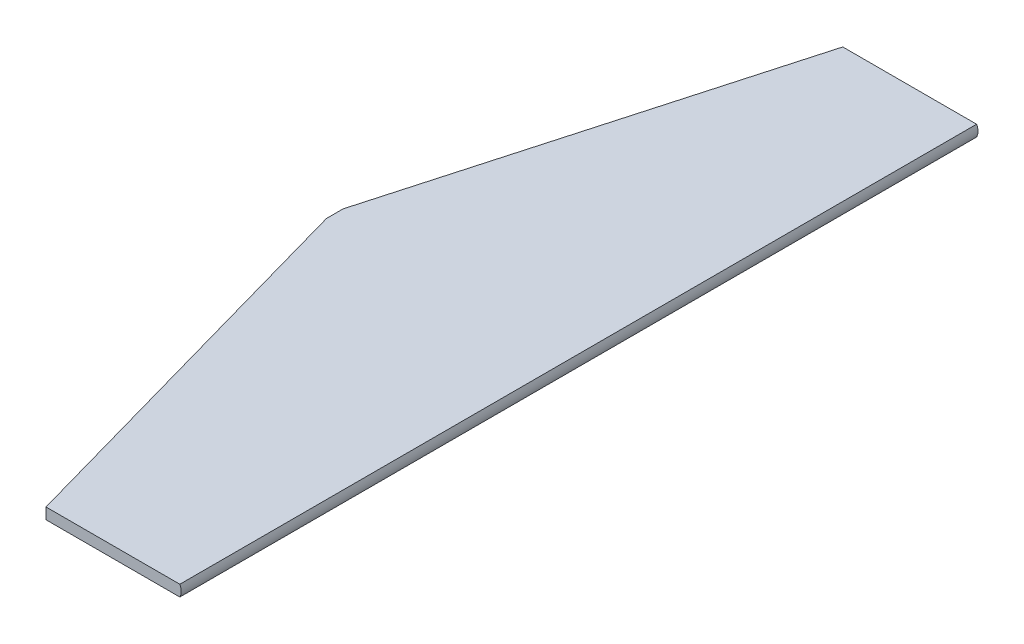
ISO-10303-21;
HEADER;
FILE_DESCRIPTION(('STEP AP214'),'2;1');
FILE_NAME('part.step','',(''),(''),'','','');
FILE_SCHEMA(('AUTOMOTIVE_DESIGN { 1 0 10303 214 1 1 1 1 }'));
ENDSEC;
DATA;
#1=APPLICATION_CONTEXT('core data for automotive mechanical design processes');
#2=APPLICATION_PROTOCOL_DEFINITION('international standard','automotive_design',2000,#1);
#3=PRODUCT_CONTEXT('',#1,'mechanical');
#4=PRODUCT('Part','Part','',(#3));
#5=PRODUCT_RELATED_PRODUCT_CATEGORY('part','',(#4));
#6=PRODUCT_DEFINITION_FORMATION('','',#4);
#7=PRODUCT_DEFINITION_CONTEXT('part definition',#1,'design');
#8=PRODUCT_DEFINITION('design','',#6,#7);
#9=PRODUCT_DEFINITION_SHAPE('','',#8);
#10=(LENGTH_UNIT() NAMED_UNIT(*) SI_UNIT(.MILLI.,.METRE.));
#11=(NAMED_UNIT(*) PLANE_ANGLE_UNIT() SI_UNIT($,.RADIAN.));
#12=(NAMED_UNIT(*) SI_UNIT($,.STERADIAN.) SOLID_ANGLE_UNIT());
#13=UNCERTAINTY_MEASURE_WITH_UNIT(LENGTH_MEASURE(1.E-05),#10,'distance_accuracy_value','');
#14=(GEOMETRIC_REPRESENTATION_CONTEXT(3) GLOBAL_UNCERTAINTY_ASSIGNED_CONTEXT((#13)) GLOBAL_UNIT_ASSIGNED_CONTEXT((#10,
#11,#12)) REPRESENTATION_CONTEXT('',''));
#15=CARTESIAN_POINT('',(0.,0.,0.));
#16=DIRECTION('',(0.,0.,1.));
#17=DIRECTION('',(1.,0.,0.));
#18=AXIS2_PLACEMENT_3D('',#15,#16,#17);
#19=CARTESIAN_POINT('',(52.4661441714905,8.,3.00000000000001));
#20=DIRECTION('',(1.,0.,0.));
#21=DIRECTION('',(0.,0.,-1.));
#22=AXIS2_PLACEMENT_3D('',#19,#20,#21);
#23=PLANE('',#22);
#24=DIRECTION('',(0.,0.,1.));
#25=VECTOR('',#24,1.);
#26=CARTESIAN_POINT('',(52.4661441714905,2.,3.00000000000001));
#27=LINE('',#26,#25);
#28=CARTESIAN_POINT('',(52.4661441714905,2.,3.00000000000001));
#29=VERTEX_POINT('',#28);
#30=CARTESIAN_POINT('',(52.4661441714905,2.,12.));
#31=VERTEX_POINT('',#30);
#32=EDGE_CURVE('E114',#29,#31,#27,.T.);
#33=ORIENTED_EDGE('',*,*,#32,.T.);
#34=DIRECTION('',(0.,-1.,0.));
#35=VECTOR('',#34,1.);
#36=CARTESIAN_POINT('',(52.4661441714905,8.,12.));
#37=LINE('',#36,#35);
#38=CARTESIAN_POINT('',(52.4661441714905,8.,12.));
#39=VERTEX_POINT('',#38);
#40=EDGE_CURVE('E11',#39,#31,#37,.T.);
#41=ORIENTED_EDGE('',*,*,#40,.F.);
#42=DIRECTION('',(0.,0.,1.));
#43=VECTOR('',#42,1.);
#44=CARTESIAN_POINT('',(52.4661441714905,8.,3.00000000000001));
#45=LINE('',#44,#43);
#46=CARTESIAN_POINT('',(52.4661441714905,8.,3.00000000000001));
#47=VERTEX_POINT('',#46);
#48=EDGE_CURVE('E122',#47,#39,#45,.T.);
#49=ORIENTED_EDGE('',*,*,#48,.F.);
#50=DIRECTION('',(0.,-1.,0.));
#51=VECTOR('',#50,1.);
#52=CARTESIAN_POINT('',(52.4661441714905,8.,3.00000000000001));
#53=LINE('',#52,#51);
#54=EDGE_CURVE('E126',#47,#29,#53,.T.);
#55=ORIENTED_EDGE('',*,*,#54,.T.);
#56=EDGE_LOOP('',(#33,#41,#49,#55));
#57=FACE_BOUND('',#56,.T.);
#58=ADVANCED_FACE('F37',(#57),#23,.F.);
#59=CARTESIAN_POINT('',(111.626144171491,8.,222.54));
#60=DIRECTION('',(0.962715715253088,0.,-0.270515159657892));
#61=DIRECTION('',(-0.270515159657892,0.,-0.962715715253088));
#62=AXIS2_PLACEMENT_3D('',#59,#60,#61);
#63=PLANE('',#62);
#64=DIRECTION('',(0.270515159657892,0.,0.962715715253088));
#65=VECTOR('',#64,1.);
#66=CARTESIAN_POINT('',(111.626144171491,2.,222.54));
#67=LINE('',#66,#65);
#68=CARTESIAN_POINT('',(111.626144171491,2.,222.54));
#69=VERTEX_POINT('',#68);
#70=EDGE_CURVE('E118',#31,#69,#67,.T.);
#71=ORIENTED_EDGE('',*,*,#70,.T.);
#72=DIRECTION('',(0.,-1.,0.));
#73=VECTOR('',#72,1.);
#74=CARTESIAN_POINT('',(111.626144171491,8.,222.54));
#75=LINE('',#74,#73);
#76=CARTESIAN_POINT('',(111.626144171491,8.,222.54));
#77=VERTEX_POINT('',#76);
#78=EDGE_CURVE('E45',#77,#69,#75,.T.);
#79=ORIENTED_EDGE('',*,*,#78,.F.);
#80=DIRECTION('',(0.270515159657892,0.,0.962715715253088));
#81=VECTOR('',#80,1.);
#82=CARTESIAN_POINT('',(111.626144171491,8.,222.54));
#83=LINE('',#82,#81);
#84=EDGE_CURVE('E88',#39,#77,#83,.T.);
#85=ORIENTED_EDGE('',*,*,#84,.F.);
#86=ORIENTED_EDGE('',*,*,#40,.T.);
#87=EDGE_LOOP('',(#71,#79,#85,#86));
#88=FACE_BOUND('',#87,.T.);
#89=ADVANCED_FACE('F157',(#88),#63,.F.);
#90=CARTESIAN_POINT('',(183.866144171491,8.,222.54));
#91=DIRECTION('',(0.,0.,-1.));
#92=DIRECTION('',(-1.,0.,0.));
#93=AXIS2_PLACEMENT_3D('',#90,#91,#92);
#94=PLANE('',#93);
#95=DIRECTION('',(1.,0.,0.));
#96=VECTOR('',#95,1.);
#97=CARTESIAN_POINT('',(183.866144171491,2.,222.54));
#98=LINE('',#97,#96);
#99=CARTESIAN_POINT('',(183.866144171491,2.,222.54));
#100=VERTEX_POINT('',#99);
#101=EDGE_CURVE('E129',#69,#100,#98,.T.);
#102=ORIENTED_EDGE('',*,*,#101,.T.);
#103=CARTESIAN_POINT('',(178.25365809133,5.,222.54));
#104=DIRECTION('',(0.,0.,1.));
#105=DIRECTION('',(-1.,0.,0.));
#106=AXIS2_PLACEMENT_3D('',#103,#104,#105);
#107=CIRCLE('',#106,6.36396103067895);
#108=CARTESIAN_POINT('',(183.866144171491,8.,222.54));
#109=VERTEX_POINT('',#108);
#110=EDGE_CURVE('E115',#100,#109,#107,.T.);
#111=ORIENTED_EDGE('',*,*,#110,.T.);
#112=DIRECTION('',(1.,0.,0.));
#113=VECTOR('',#112,1.);
#114=CARTESIAN_POINT('',(183.866144171491,8.,222.54));
#115=LINE('',#114,#113);
#116=EDGE_CURVE('E101',#77,#109,#115,.T.);
#117=ORIENTED_EDGE('',*,*,#116,.F.);
#118=ORIENTED_EDGE('',*,*,#78,.T.);
#119=EDGE_LOOP('',(#102,#111,#117,#118));
#120=FACE_BOUND('',#119,.T.);
#121=ADVANCED_FACE('F139',(#120),#94,.F.);
#122=CARTESIAN_POINT('',(183.866144171491,8.,-207.54));
#123=DIRECTION('',(0.,0.,1.));
#124=DIRECTION('',(1.,0.,0.));
#125=AXIS2_PLACEMENT_3D('',#122,#123,#124);
#126=PLANE('',#125);
#127=DIRECTION('',(-1.,0.,0.));
#128=VECTOR('',#127,1.);
#129=CARTESIAN_POINT('',(183.866144171491,2.,-207.54));
#130=LINE('',#129,#128);
#131=CARTESIAN_POINT('',(183.866144171491,2.,-207.54));
#132=VERTEX_POINT('',#131);
#133=CARTESIAN_POINT('',(111.626144171491,2.,-207.54));
#134=VERTEX_POINT('',#133);
#135=EDGE_CURVE('E74',#132,#134,#130,.T.);
#136=ORIENTED_EDGE('',*,*,#135,.T.);
#137=DIRECTION('',(0.,-1.,0.));
#138=VECTOR('',#137,1.);
#139=CARTESIAN_POINT('',(111.626144171491,8.,-207.54));
#140=LINE('',#139,#138);
#141=CARTESIAN_POINT('',(111.626144171491,8.,-207.54));
#142=VERTEX_POINT('',#141);
#143=EDGE_CURVE('E110',#142,#134,#140,.T.);
#144=ORIENTED_EDGE('',*,*,#143,.F.);
#145=DIRECTION('',(-1.,0.,0.));
#146=VECTOR('',#145,1.);
#147=CARTESIAN_POINT('',(183.866144171491,8.,-207.54));
#148=LINE('',#147,#146);
#149=CARTESIAN_POINT('',(183.866144171491,8.,-207.54));
#150=VERTEX_POINT('',#149);
#151=EDGE_CURVE('E99',#150,#142,#148,.T.);
#152=ORIENTED_EDGE('',*,*,#151,.F.);
#153=CARTESIAN_POINT('',(178.25365809133,5.,-207.54));
#154=DIRECTION('',(0.,0.,1.));
#155=DIRECTION('',(1.,0.,0.));
#156=AXIS2_PLACEMENT_3D('',#153,#154,#155);
#157=CIRCLE('',#156,6.36396103067895);
#158=EDGE_CURVE('E108',#150,#132,#157,.F.);
#159=ORIENTED_EDGE('',*,*,#158,.T.);
#160=EDGE_LOOP('',(#136,#144,#152,#159));
#161=FACE_BOUND('',#160,.T.);
#162=ADVANCED_FACE('F107',(#161),#126,.F.);
#163=CARTESIAN_POINT('',(111.626144171491,8.,-207.54));
#164=DIRECTION('',(0.962715715253088,0.,0.270515159657892));
#165=DIRECTION('',(0.270515159657892,0.,-0.962715715253088));
#166=AXIS2_PLACEMENT_3D('',#163,#164,#165);
#167=PLANE('',#166);
#168=DIRECTION('',(-0.270515159657892,0.,0.962715715253088));
#169=VECTOR('',#168,1.);
#170=CARTESIAN_POINT('',(111.626144171491,2.,-207.54));
#171=LINE('',#170,#169);
#172=EDGE_CURVE('E80',#134,#29,#171,.T.);
#173=ORIENTED_EDGE('',*,*,#172,.T.);
#174=ORIENTED_EDGE('',*,*,#54,.F.);
#175=DIRECTION('',(-0.270515159657892,0.,0.962715715253088));
#176=VECTOR('',#175,1.);
#177=CARTESIAN_POINT('',(111.626144171491,8.,-207.54));
#178=LINE('',#177,#176);
#179=EDGE_CURVE('E53',#142,#47,#178,.T.);
#180=ORIENTED_EDGE('',*,*,#179,.F.);
#181=ORIENTED_EDGE('',*,*,#143,.T.);
#182=EDGE_LOOP('',(#173,#174,#180,#181));
#183=FACE_BOUND('',#182,.T.);
#184=ADVANCED_FACE('F146',(#183),#167,.F.);
#185=CARTESIAN_POINT('',(52.4661441714905,8.,3.00000000000001));
#186=DIRECTION('',(0.,-1.,0.));
#187=DIRECTION('',(0.,0.,-1.));
#188=AXIS2_PLACEMENT_3D('',#185,#186,#187);
#189=PLANE('',#188);
#190=ORIENTED_EDGE('',*,*,#48,.T.);
#191=ORIENTED_EDGE('',*,*,#84,.T.);
#192=ORIENTED_EDGE('',*,*,#116,.T.);
#193=DIRECTION('',(0.,0.,-1.));
#194=VECTOR('',#193,1.);
#195=CARTESIAN_POINT('',(183.866144171491,8.,12.));
#196=LINE('',#195,#194);
#197=EDGE_CURVE('E96',#109,#150,#196,.T.);
#198=ORIENTED_EDGE('',*,*,#197,.T.);
#199=ORIENTED_EDGE('',*,*,#151,.T.);
#200=ORIENTED_EDGE('',*,*,#179,.T.);
#201=EDGE_LOOP('',(#190,#191,#192,#198,#199,#200));
#202=FACE_BOUND('',#201,.T.);
#203=ADVANCED_FACE('F98',(#202),#189,.F.);
#204=CARTESIAN_POINT('',(52.4661441714905,2.,3.00000000000001));
#205=DIRECTION('',(0.,-1.,0.));
#206=DIRECTION('',(0.,0.,-1.));
#207=AXIS2_PLACEMENT_3D('',#204,#205,#206);
#208=PLANE('',#207);
#209=ORIENTED_EDGE('',*,*,#32,.F.);
#210=ORIENTED_EDGE('',*,*,#172,.F.);
#211=ORIENTED_EDGE('',*,*,#135,.F.);
#212=DIRECTION('',(0.,0.,-1.));
#213=VECTOR('',#212,1.);
#214=CARTESIAN_POINT('',(183.866144171491,2.,3.00000000000001));
#215=LINE('',#214,#213);
#216=EDGE_CURVE('E113',#100,#132,#215,.T.);
#217=ORIENTED_EDGE('',*,*,#216,.F.);
#218=ORIENTED_EDGE('',*,*,#101,.F.);
#219=ORIENTED_EDGE('',*,*,#70,.F.);
#220=EDGE_LOOP('',(#209,#210,#211,#217,#218,#219));
#221=FACE_BOUND('',#220,.T.);
#222=ADVANCED_FACE('F142',(#221),#208,.T.);
#223=CARTESIAN_POINT('',(178.25365809133,5.,-213.586876433437));
#224=DIRECTION('',(0.,0.,1.));
#225=DIRECTION('',(1.,0.,0.));
#226=AXIS2_PLACEMENT_3D('',#223,#224,#225);
#227=CYLINDRICAL_SURFACE('',#226,6.36396103067895);
#228=ORIENTED_EDGE('',*,*,#158,.F.);
#229=ORIENTED_EDGE('',*,*,#197,.F.);
#230=ORIENTED_EDGE('',*,*,#110,.F.);
#231=ORIENTED_EDGE('',*,*,#216,.T.);
#232=EDGE_LOOP('',(#228,#229,#230,#231));
#233=FACE_BOUND('',#232,.T.);
#234=ADVANCED_FACE('F112',(#233),#227,.T.);
#235=CLOSED_SHELL('',(#58,#89,#121,#162,#184,#203,#222,#234));
#236=MANIFOLD_SOLID_BREP('B2',#235);
#237=ADVANCED_BREP_SHAPE_REPRESENTATION('',(#18,#236),#14);
#238=SHAPE_DEFINITION_REPRESENTATION(#9,#237);
ENDSEC;
END-ISO-10303-21;
